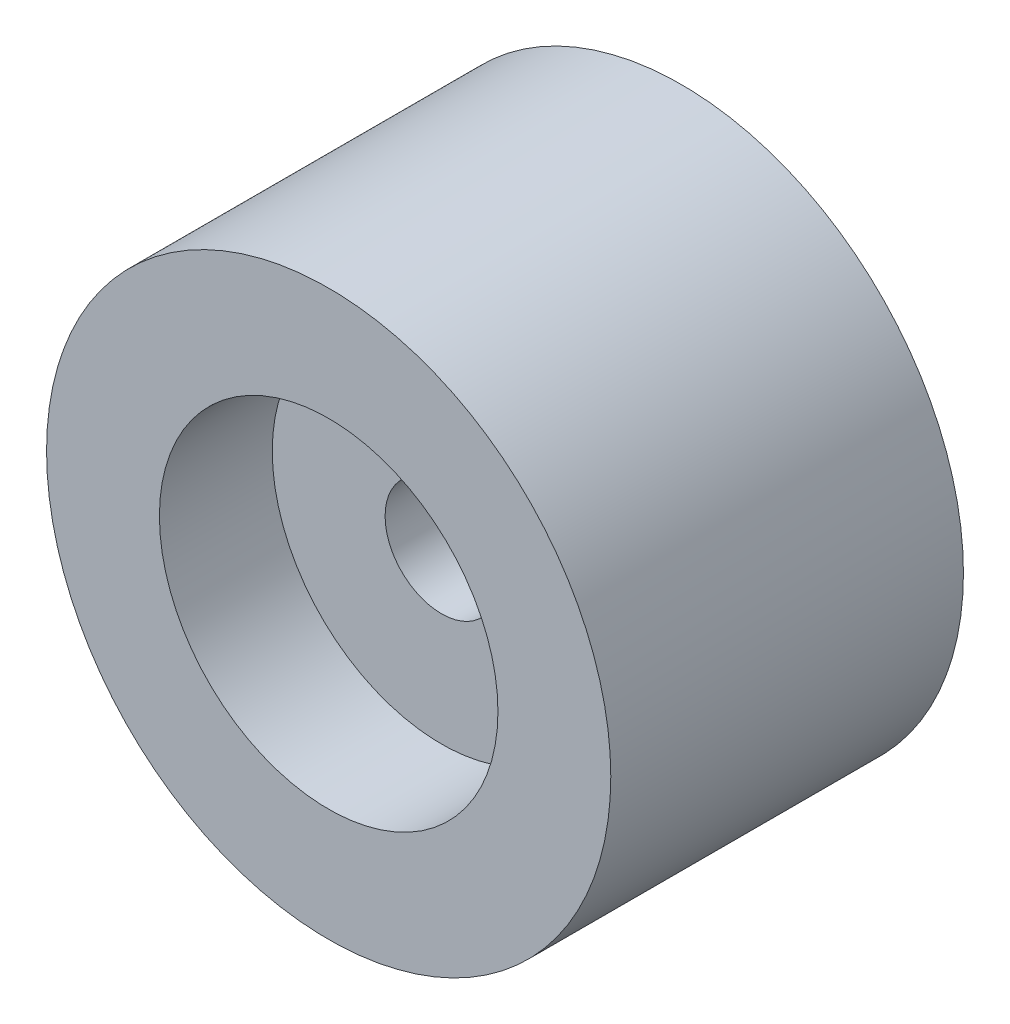
ISO-10303-21;
HEADER;
FILE_DESCRIPTION(('STEP AP214'),'2;1');
FILE_NAME('part.step','',(''),(''),'','','');
FILE_SCHEMA(('AUTOMOTIVE_DESIGN { 1 0 10303 214 1 1 1 1 }'));
ENDSEC;
DATA;
#1=APPLICATION_CONTEXT('core data for automotive mechanical design processes');
#2=APPLICATION_PROTOCOL_DEFINITION('international standard','automotive_design',2000,#1);
#3=PRODUCT_CONTEXT('',#1,'mechanical');
#4=PRODUCT('Part','Part','',(#3));
#5=PRODUCT_RELATED_PRODUCT_CATEGORY('part','',(#4));
#6=PRODUCT_DEFINITION_FORMATION('','',#4);
#7=PRODUCT_DEFINITION_CONTEXT('part definition',#1,'design');
#8=PRODUCT_DEFINITION('design','',#6,#7);
#9=PRODUCT_DEFINITION_SHAPE('','',#8);
#10=(LENGTH_UNIT() NAMED_UNIT(*) SI_UNIT(.MILLI.,.METRE.));
#11=(NAMED_UNIT(*) PLANE_ANGLE_UNIT() SI_UNIT($,.RADIAN.));
#12=(NAMED_UNIT(*) SI_UNIT($,.STERADIAN.) SOLID_ANGLE_UNIT());
#13=UNCERTAINTY_MEASURE_WITH_UNIT(LENGTH_MEASURE(1.E-05),#10,'distance_accuracy_value','');
#14=(GEOMETRIC_REPRESENTATION_CONTEXT(3) GLOBAL_UNCERTAINTY_ASSIGNED_CONTEXT((#13)) GLOBAL_UNIT_ASSIGNED_CONTEXT((#10,
#11,#12)) REPRESENTATION_CONTEXT('',''));
#15=CARTESIAN_POINT('',(0.,0.,0.));
#16=DIRECTION('',(0.,0.,1.));
#17=DIRECTION('',(1.,0.,0.));
#18=AXIS2_PLACEMENT_3D('',#15,#16,#17);
#19=CARTESIAN_POINT('',(-43.92062287607,23.4000034413043,25.));
#20=DIRECTION('',(0.,0.,-1.));
#21=DIRECTION('',(-1.,0.,0.));
#22=AXIS2_PLACEMENT_3D('',#19,#20,#21);
#23=CYLINDRICAL_SURFACE('',#22,4.00000000000001);
#24=CARTESIAN_POINT('',(-43.92062287607,23.4000034413043,17.));
#25=DIRECTION('',(0.,0.,1.));
#26=DIRECTION('',(1.,0.,0.));
#27=AXIS2_PLACEMENT_3D('',#24,#25,#26);
#28=CIRCLE('',#27,4.00000000000001);
#29=CARTESIAN_POINT('',(-39.92062287607,23.4000034413043,17.));
#30=VERTEX_POINT('',#29);
#31=EDGE_CURVE('E46',#30,#30,#28,.T.);
#32=ORIENTED_EDGE('',*,*,#31,.T.);
#33=EDGE_LOOP('',(#32));
#34=FACE_BOUND('',#33,.T.);
#35=CARTESIAN_POINT('',(-43.92062287607,23.4000034413043,8.));
#36=DIRECTION('',(0.,0.,-1.));
#37=DIRECTION('',(-1.,0.,0.));
#38=AXIS2_PLACEMENT_3D('',#35,#36,#37);
#39=CIRCLE('',#38,4.00000000000001);
#40=CARTESIAN_POINT('',(-47.92062287607,23.4000034413043,8.));
#41=VERTEX_POINT('',#40);
#42=EDGE_CURVE('E37',#41,#41,#39,.T.);
#43=ORIENTED_EDGE('',*,*,#42,.T.);
#44=EDGE_LOOP('',(#43));
#45=FACE_BOUND('',#44,.T.);
#46=ADVANCED_FACE('F33',(#34,#45),#23,.F.);
#47=CARTESIAN_POINT('',(-43.92062287607,23.4000034413043,25.));
#48=DIRECTION('',(0.,0.,1.));
#49=DIRECTION('',(1.,0.,0.));
#50=AXIS2_PLACEMENT_3D('',#47,#48,#49);
#51=PLANE('',#50);
#52=CARTESIAN_POINT('',(-43.92062287607,23.4000034413043,25.));
#53=DIRECTION('',(0.,0.,1.));
#54=DIRECTION('',(1.,0.,0.));
#55=AXIS2_PLACEMENT_3D('',#52,#53,#54);
#56=CIRCLE('',#55,12.);
#57=CARTESIAN_POINT('',(-31.92062287607,23.4000034413043,25.));
#58=VERTEX_POINT('',#57);
#59=EDGE_CURVE('E49',#58,#58,#56,.T.);
#60=ORIENTED_EDGE('',*,*,#59,.F.);
#61=EDGE_LOOP('',(#60));
#62=FACE_BOUND('',#61,.T.);
#63=CARTESIAN_POINT('',(-43.92062287607,23.4000034413043,25.));
#64=DIRECTION('',(0.,0.,1.));
#65=DIRECTION('',(1.,0.,0.));
#66=AXIS2_PLACEMENT_3D('',#63,#64,#65);
#67=CIRCLE('',#66,20.);
#68=CARTESIAN_POINT('',(-23.92062287607,23.4000034413043,25.));
#69=VERTEX_POINT('',#68);
#70=EDGE_CURVE('E10',#69,#69,#67,.T.);
#71=ORIENTED_EDGE('',*,*,#70,.T.);
#72=EDGE_LOOP('',(#71));
#73=FACE_BOUND('',#72,.T.);
#74=ADVANCED_FACE('F82',(#62,#73),#51,.T.);
#75=CARTESIAN_POINT('',(-43.92062287607,23.4000034413043,0.));
#76=DIRECTION('',(0.,0.,1.));
#77=DIRECTION('',(1.,0.,0.));
#78=AXIS2_PLACEMENT_3D('',#75,#76,#77);
#79=PLANE('',#78);
#80=CARTESIAN_POINT('',(-43.92062287607,23.4000034413043,0.));
#81=DIRECTION('',(0.,0.,-1.));
#82=DIRECTION('',(-1.,0.,0.));
#83=AXIS2_PLACEMENT_3D('',#80,#81,#82);
#84=CIRCLE('',#83,12.);
#85=CARTESIAN_POINT('',(-55.92062287607,23.4000034413043,0.));
#86=VERTEX_POINT('',#85);
#87=EDGE_CURVE('E60',#86,#86,#84,.T.);
#88=ORIENTED_EDGE('',*,*,#87,.F.);
#89=EDGE_LOOP('',(#88));
#90=FACE_BOUND('',#89,.T.);
#91=CARTESIAN_POINT('',(-43.92062287607,23.4000034413043,0.));
#92=DIRECTION('',(0.,0.,1.));
#93=DIRECTION('',(1.,0.,0.));
#94=AXIS2_PLACEMENT_3D('',#91,#92,#93);
#95=CIRCLE('',#94,20.);
#96=CARTESIAN_POINT('',(-23.92062287607,23.4000034413043,0.));
#97=VERTEX_POINT('',#96);
#98=EDGE_CURVE('E41',#97,#97,#95,.T.);
#99=ORIENTED_EDGE('',*,*,#98,.F.);
#100=EDGE_LOOP('',(#99));
#101=FACE_BOUND('',#100,.T.);
#102=ADVANCED_FACE('F87',(#90,#101),#79,.F.);
#103=CARTESIAN_POINT('',(-43.92062287607,23.4000034413043,25.));
#104=DIRECTION('',(0.,0.,-1.));
#105=DIRECTION('',(-1.,0.,0.));
#106=AXIS2_PLACEMENT_3D('',#103,#104,#105);
#107=CYLINDRICAL_SURFACE('',#106,20.);
#108=ORIENTED_EDGE('',*,*,#70,.F.);
#109=EDGE_LOOP('',(#108));
#110=FACE_BOUND('',#109,.T.);
#111=ORIENTED_EDGE('',*,*,#98,.T.);
#112=EDGE_LOOP('',(#111));
#113=FACE_BOUND('',#112,.T.);
#114=ADVANCED_FACE('F35',(#110,#113),#107,.T.);
#115=CARTESIAN_POINT('',(-43.92062287607,23.4000034413043,17.));
#116=DIRECTION('',(0.,0.,1.));
#117=DIRECTION('',(1.,0.,0.));
#118=AXIS2_PLACEMENT_3D('',#115,#116,#117);
#119=CYLINDRICAL_SURFACE('',#118,12.);
#120=CARTESIAN_POINT('',(-43.92062287607,23.4000034413043,17.));
#121=DIRECTION('',(0.,0.,1.));
#122=DIRECTION('',(1.,0.,0.));
#123=AXIS2_PLACEMENT_3D('',#120,#121,#122);
#124=CIRCLE('',#123,12.);
#125=CARTESIAN_POINT('',(-31.92062287607,23.4000034413043,17.));
#126=VERTEX_POINT('',#125);
#127=EDGE_CURVE('E52',#126,#126,#124,.T.);
#128=ORIENTED_EDGE('',*,*,#127,.F.);
#129=EDGE_LOOP('',(#128));
#130=FACE_BOUND('',#129,.T.);
#131=ORIENTED_EDGE('',*,*,#59,.T.);
#132=EDGE_LOOP('',(#131));
#133=FACE_BOUND('',#132,.T.);
#134=ADVANCED_FACE('F91',(#130,#133),#119,.F.);
#135=CARTESIAN_POINT('',(-43.92062287607,23.4000034413043,17.));
#136=DIRECTION('',(0.,0.,1.));
#137=DIRECTION('',(1.,0.,0.));
#138=AXIS2_PLACEMENT_3D('',#135,#136,#137);
#139=PLANE('',#138);
#140=ORIENTED_EDGE('',*,*,#31,.F.);
#141=EDGE_LOOP('',(#140));
#142=FACE_BOUND('',#141,.T.);
#143=ORIENTED_EDGE('',*,*,#127,.T.);
#144=EDGE_LOOP('',(#143));
#145=FACE_BOUND('',#144,.T.);
#146=ADVANCED_FACE('F78',(#142,#145),#139,.T.);
#147=CARTESIAN_POINT('',(-43.92062287607,23.4000034413043,8.));
#148=DIRECTION('',(0.,0.,-1.));
#149=DIRECTION('',(-1.,0.,0.));
#150=AXIS2_PLACEMENT_3D('',#147,#148,#149);
#151=CYLINDRICAL_SURFACE('',#150,12.);
#152=CARTESIAN_POINT('',(-43.92062287607,23.4000034413043,8.));
#153=DIRECTION('',(0.,0.,-1.));
#154=DIRECTION('',(-1.,0.,0.));
#155=AXIS2_PLACEMENT_3D('',#152,#153,#154);
#156=CIRCLE('',#155,12.);
#157=CARTESIAN_POINT('',(-55.92062287607,23.4000034413043,8.));
#158=VERTEX_POINT('',#157);
#159=EDGE_CURVE('E63',#158,#158,#156,.T.);
#160=ORIENTED_EDGE('',*,*,#159,.F.);
#161=EDGE_LOOP('',(#160));
#162=FACE_BOUND('',#161,.T.);
#163=ORIENTED_EDGE('',*,*,#87,.T.);
#164=EDGE_LOOP('',(#163));
#165=FACE_BOUND('',#164,.T.);
#166=ADVANCED_FACE('F73',(#162,#165),#151,.F.);
#167=CARTESIAN_POINT('',(-43.92062287607,23.4000034413043,8.));
#168=DIRECTION('',(0.,0.,-1.));
#169=DIRECTION('',(-1.,0.,0.));
#170=AXIS2_PLACEMENT_3D('',#167,#168,#169);
#171=PLANE('',#170);
#172=ORIENTED_EDGE('',*,*,#42,.F.);
#173=EDGE_LOOP('',(#172));
#174=FACE_BOUND('',#173,.T.);
#175=ORIENTED_EDGE('',*,*,#159,.T.);
#176=EDGE_LOOP('',(#175));
#177=FACE_BOUND('',#176,.T.);
#178=ADVANCED_FACE('F71',(#174,#177),#171,.T.);
#179=CLOSED_SHELL('',(#46,#74,#102,#114,#134,#146,#166,#178));
#180=MANIFOLD_SOLID_BREP('B2',#179);
#181=ADVANCED_BREP_SHAPE_REPRESENTATION('',(#18,#180),#14);
#182=SHAPE_DEFINITION_REPRESENTATION(#9,#181);
ENDSEC;
END-ISO-10303-21;
